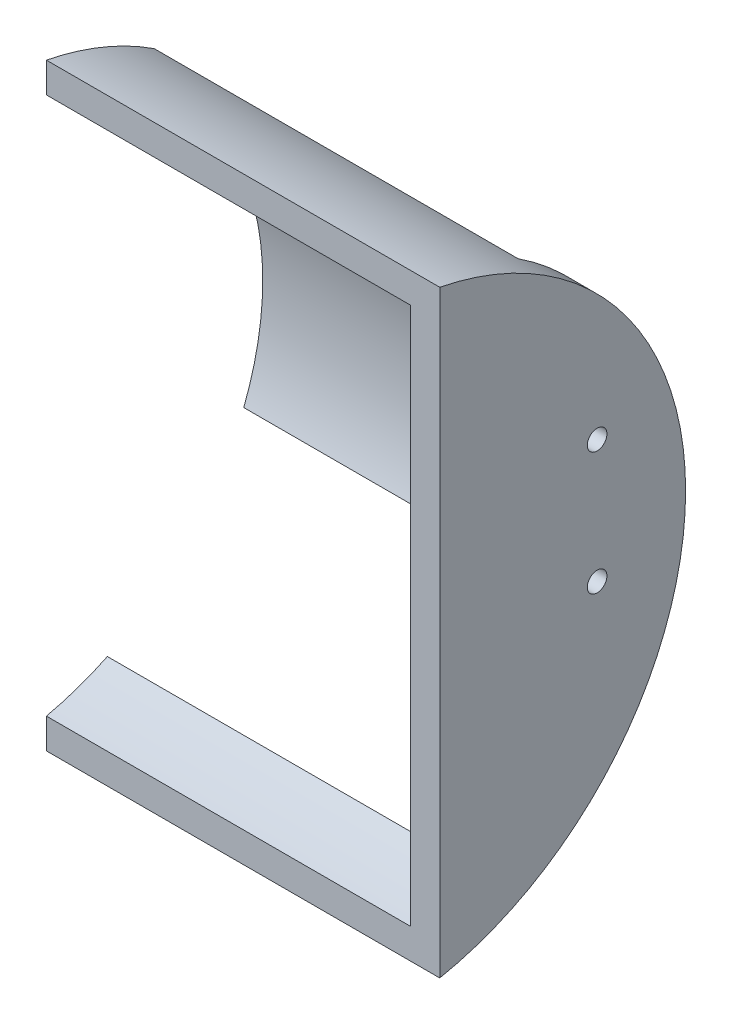
ISO-10303-21;
HEADER;
FILE_DESCRIPTION(('STEP AP214'),'2;1');
FILE_NAME('part.step','',(''),(''),'','','');
FILE_SCHEMA(('AUTOMOTIVE_DESIGN { 1 0 10303 214 1 1 1 1 }'));
ENDSEC;
DATA;
#1=APPLICATION_CONTEXT('core data for automotive mechanical design processes');
#2=APPLICATION_PROTOCOL_DEFINITION('international standard','automotive_design',2000,#1);
#3=PRODUCT_CONTEXT('',#1,'mechanical');
#4=PRODUCT('Part','Part','',(#3));
#5=PRODUCT_RELATED_PRODUCT_CATEGORY('part','',(#4));
#6=PRODUCT_DEFINITION_FORMATION('','',#4);
#7=PRODUCT_DEFINITION_CONTEXT('part definition',#1,'design');
#8=PRODUCT_DEFINITION('design','',#6,#7);
#9=PRODUCT_DEFINITION_SHAPE('','',#8);
#10=(LENGTH_UNIT() NAMED_UNIT(*) SI_UNIT(.MILLI.,.METRE.));
#11=(NAMED_UNIT(*) PLANE_ANGLE_UNIT() SI_UNIT($,.RADIAN.));
#12=(NAMED_UNIT(*) SI_UNIT($,.STERADIAN.) SOLID_ANGLE_UNIT());
#13=UNCERTAINTY_MEASURE_WITH_UNIT(LENGTH_MEASURE(1.E-05),#10,'distance_accuracy_value','');
#14=(GEOMETRIC_REPRESENTATION_CONTEXT(3) GLOBAL_UNCERTAINTY_ASSIGNED_CONTEXT((#13)) GLOBAL_UNIT_ASSIGNED_CONTEXT((#10,
#11,#12)) REPRESENTATION_CONTEXT('',''));
#15=CARTESIAN_POINT('',(0.,0.,0.));
#16=DIRECTION('',(0.,0.,1.));
#17=DIRECTION('',(1.,0.,0.));
#18=AXIS2_PLACEMENT_3D('',#15,#16,#17);
#19=CARTESIAN_POINT('',(-3.,0.,0.));
#20=DIRECTION('',(-1.,0.,0.));
#21=DIRECTION('',(0.,0.,1.));
#22=AXIS2_PLACEMENT_3D('',#19,#20,#21);
#23=PLANE('',#22);
#24=CARTESIAN_POINT('',(-3.,10.,-10.5));
#25=DIRECTION('',(-1.,0.,0.));
#26=DIRECTION('',(0.,0.,1.));
#27=AXIS2_PLACEMENT_3D('',#24,#25,#26);
#28=CIRCLE('',#27,1.);
#29=CARTESIAN_POINT('',(-3.,10.,-9.5));
#30=VERTEX_POINT('',#29);
#31=EDGE_CURVE('E139',#30,#30,#28,.F.);
#32=ORIENTED_EDGE('',*,*,#31,.T.);
#33=EDGE_LOOP('',(#32));
#34=FACE_BOUND('',#33,.T.);
#35=CARTESIAN_POINT('',(-3.,-2.5,-10.5));
#36=DIRECTION('',(-1.,0.,0.));
#37=DIRECTION('',(0.,0.,1.));
#38=AXIS2_PLACEMENT_3D('',#35,#36,#37);
#39=CIRCLE('',#38,1.);
#40=CARTESIAN_POINT('',(-3.,-2.5,-9.5));
#41=VERTEX_POINT('',#40);
#42=EDGE_CURVE('E226',#41,#41,#39,.F.);
#43=ORIENTED_EDGE('',*,*,#42,.T.);
#44=EDGE_LOOP('',(#43));
#45=FACE_BOUND('',#44,.T.);
#46=DIRECTION('',(0.,-0.766044443118977,0.642787609686541));
#47=VECTOR('',#46,1.);
#48=CARTESIAN_POINT('',(-3.,8.44107654315466,10.0596832956672));
#49=LINE('',#48,#47);
#50=CARTESIAN_POINT('',(-3.,26.944745071491,-5.46673814188647));
#51=VERTEX_POINT('',#50);
#52=CARTESIAN_POINT('',(-3.,24.628474028026,-3.52315596360837));
#53=VERTEX_POINT('',#52);
#54=EDGE_CURVE('E217',#51,#53,#49,.T.);
#55=ORIENTED_EDGE('',*,*,#54,.F.);
#56=CARTESIAN_POINT('',(-3.,1.,11.5));
#57=DIRECTION('',(-1.,0.,0.));
#58=DIRECTION('',(0.,0.,1.));
#59=AXIS2_PLACEMENT_3D('',#56,#57,#58);
#60=CIRCLE('',#59,31.);
#61=CARTESIAN_POINT('',(-3.,12.2428305284079,-17.3894230075559));
#62=VERTEX_POINT('',#61);
#63=EDGE_CURVE('E222',#51,#62,#60,.T.);
#64=ORIENTED_EDGE('',*,*,#63,.T.);
#65=DIRECTION('',(0.,-0.342020143325666,0.93969262078591));
#66=VECTOR('',#65,1.);
#67=CARTESIAN_POINT('',(-3.,5.22183858694362,1.90059381379014));
#68=LINE('',#67,#66);
#69=CARTESIAN_POINT('',(-3.,11.2164934279559,-14.5695849993155));
#70=VERTEX_POINT('',#69);
#71=EDGE_CURVE('E214',#62,#70,#68,.T.);
#72=ORIENTED_EDGE('',*,*,#71,.T.);
#73=CARTESIAN_POINT('',(-3.,1.,11.5));
#74=DIRECTION('',(-1.,0.,0.));
#75=DIRECTION('',(0.,0.,1.));
#76=AXIS2_PLACEMENT_3D('',#73,#74,#75);
#77=CIRCLE('',#76,28.);
#78=CARTESIAN_POINT('',(-3.,-9.21649342795605,-14.5695849993154));
#79=VERTEX_POINT('',#78);
#80=EDGE_CURVE('E63',#79,#70,#77,.F.);
#81=ORIENTED_EDGE('',*,*,#80,.F.);
#82=DIRECTION('',(0.,0.342020143325675,0.939692620785906));
#83=VECTOR('',#82,1.);
#84=CARTESIAN_POINT('',(-3.,-3.45579414382467,1.25780620410366));
#85=LINE('',#84,#83);
#86=CARTESIAN_POINT('',(-3.,-10.2428305284081,-17.3894230075558));
#87=VERTEX_POINT('',#86);
#88=EDGE_CURVE('E212',#87,#79,#85,.T.);
#89=ORIENTED_EDGE('',*,*,#88,.F.);
#90=CARTESIAN_POINT('',(-3.,-26.5654322169714,-2.68262834214992));
#91=VERTEX_POINT('',#90);
#92=EDGE_CURVE('E220',#87,#91,#60,.T.);
#93=ORIENTED_EDGE('',*,*,#92,.T.);
#94=DIRECTION('',(0.,0.766044443118982,0.642787609686535));
#95=VECTOR('',#94,1.);
#96=CARTESIAN_POINT('',(-3.,-9.65526006688007,11.5066908721359));
#97=LINE('',#96,#95);
#98=CARTESIAN_POINT('',(-3.,-24.2024521669593,-0.69985265370554));
#99=VERTEX_POINT('',#98);
#100=EDGE_CURVE('E209',#91,#99,#97,.T.);
#101=ORIENTED_EDGE('',*,*,#100,.T.);
#102=CARTESIAN_POINT('',(-3.,1.,11.5));
#103=DIRECTION('',(-1.,0.,0.));
#104=DIRECTION('',(0.,0.,1.));
#105=AXIS2_PLACEMENT_3D('',#102,#103,#104);
#106=CIRCLE('',#105,28.);
#107=CARTESIAN_POINT('',(-3.,-26.3495886623547,5.5));
#108=VERTEX_POINT('',#107);
#109=EDGE_CURVE('E167',#108,#99,#106,.F.);
#110=ORIENTED_EDGE('',*,*,#109,.F.);
#111=DIRECTION('',(0.,1.,0.));
#112=VECTOR('',#111,1.);
#113=CARTESIAN_POINT('',(-3.,0.,5.5));
#114=LINE('',#113,#112);
#115=CARTESIAN_POINT('',(-3.,28.3495886623547,5.49999999999999));
#116=VERTEX_POINT('',#115);
#117=EDGE_CURVE('E224',#108,#116,#114,.T.);
#118=ORIENTED_EDGE('',*,*,#117,.T.);
#119=CARTESIAN_POINT('',(-3.,1.,11.5));
#120=DIRECTION('',(-1.,0.,0.));
#121=DIRECTION('',(0.,0.,1.));
#122=AXIS2_PLACEMENT_3D('',#119,#120,#121);
#123=CIRCLE('',#122,28.);
#124=EDGE_CURVE('E56',#53,#116,#123,.F.);
#125=ORIENTED_EDGE('',*,*,#124,.F.);
#126=EDGE_LOOP('',(#55,#64,#72,#81,#89,#93,#101,#110,#118,#125));
#127=FACE_BOUND('',#126,.T.);
#128=ADVANCED_FACE('F41',(#34,#45,#127),#23,.T.);
#129=CARTESIAN_POINT('',(-3.,1.,11.5));
#130=DIRECTION('',(1.,0.,0.));
#131=DIRECTION('',(0.,0.,-1.));
#132=AXIS2_PLACEMENT_3D('',#129,#130,#131);
#133=CYLINDRICAL_SURFACE('',#132,31.);
#134=DIRECTION('',(1.,0.,0.));
#135=VECTOR('',#134,1.);
#136=CARTESIAN_POINT('',(-3.,-29.4138126514911,5.5));
#137=LINE('',#136,#135);
#138=CARTESIAN_POINT('',(-40.,-29.4138126514911,5.5));
#139=VERTEX_POINT('',#138);
#140=CARTESIAN_POINT('',(0.,-29.4138126514911,5.5));
#141=VERTEX_POINT('',#140);
#142=EDGE_CURVE('E11',#139,#141,#137,.T.);
#143=ORIENTED_EDGE('',*,*,#142,.F.);
#144=CARTESIAN_POINT('',(-40.,1.,11.5));
#145=DIRECTION('',(-1.,0.,0.));
#146=DIRECTION('',(0.,0.,1.));
#147=AXIS2_PLACEMENT_3D('',#144,#145,#146);
#148=CIRCLE('',#147,31.);
#149=CARTESIAN_POINT('',(-40.,-26.5654322169714,-2.68262834214992));
#150=VERTEX_POINT('',#149);
#151=EDGE_CURVE('E191',#150,#139,#148,.T.);
#152=ORIENTED_EDGE('',*,*,#151,.F.);
#153=DIRECTION('',(1.,0.,0.));
#154=VECTOR('',#153,1.);
#155=CARTESIAN_POINT('',(-40.,-26.5654322169714,-2.68262834214992));
#156=LINE('',#155,#154);
#157=EDGE_CURVE('E172',#150,#91,#156,.T.);
#158=ORIENTED_EDGE('',*,*,#157,.T.);
#159=ORIENTED_EDGE('',*,*,#92,.F.);
#160=DIRECTION('',(1.,0.,0.));
#161=VECTOR('',#160,1.);
#162=CARTESIAN_POINT('',(-40.,-10.2428305284081,-17.3894230075558));
#163=LINE('',#162,#161);
#164=CARTESIAN_POINT('',(-40.,-10.2428305284081,-17.3894230075558));
#165=VERTEX_POINT('',#164);
#166=EDGE_CURVE('E156',#165,#87,#163,.T.);
#167=ORIENTED_EDGE('',*,*,#166,.F.);
#168=CARTESIAN_POINT('',(-40.,1.,11.5));
#169=DIRECTION('',(-1.,0.,0.));
#170=DIRECTION('',(0.,0.,1.));
#171=AXIS2_PLACEMENT_3D('',#168,#169,#170);
#172=CIRCLE('',#171,31.);
#173=CARTESIAN_POINT('',(-40.,12.2428305284079,-17.3894230075559));
#174=VERTEX_POINT('',#173);
#175=EDGE_CURVE('E171',#174,#165,#172,.T.);
#176=ORIENTED_EDGE('',*,*,#175,.F.);
#177=DIRECTION('',(1.,0.,0.));
#178=VECTOR('',#177,1.);
#179=CARTESIAN_POINT('',(-40.,12.2428305284079,-17.3894230075559));
#180=LINE('',#179,#178);
#181=EDGE_CURVE('E153',#174,#62,#180,.T.);
#182=ORIENTED_EDGE('',*,*,#181,.T.);
#183=ORIENTED_EDGE('',*,*,#63,.F.);
#184=DIRECTION('',(1.,0.,0.));
#185=VECTOR('',#184,1.);
#186=CARTESIAN_POINT('',(-40.,26.944745071491,-5.46673814188647));
#187=LINE('',#186,#185);
#188=CARTESIAN_POINT('',(-40.,26.944745071491,-5.46673814188647));
#189=VERTEX_POINT('',#188);
#190=EDGE_CURVE('E144',#189,#51,#187,.T.);
#191=ORIENTED_EDGE('',*,*,#190,.F.);
#192=CARTESIAN_POINT('',(-40.,1.,11.5));
#193=DIRECTION('',(-1.,0.,0.));
#194=DIRECTION('',(0.,0.,1.));
#195=AXIS2_PLACEMENT_3D('',#192,#193,#194);
#196=CIRCLE('',#195,31.);
#197=CARTESIAN_POINT('',(-40.,31.4138126514911,5.49999999999999));
#198=VERTEX_POINT('',#197);
#199=EDGE_CURVE('E141',#198,#189,#196,.T.);
#200=ORIENTED_EDGE('',*,*,#199,.F.);
#201=DIRECTION('',(1.,0.,0.));
#202=VECTOR('',#201,1.);
#203=CARTESIAN_POINT('',(-3.,31.4138126514911,5.49999999999999));
#204=LINE('',#203,#202);
#205=CARTESIAN_POINT('',(0.,31.4138126514911,5.49999999999999));
#206=VERTEX_POINT('',#205);
#207=EDGE_CURVE('E49',#198,#206,#204,.T.);
#208=ORIENTED_EDGE('',*,*,#207,.T.);
#209=CARTESIAN_POINT('',(0.,1.,11.5));
#210=DIRECTION('',(-1.,0.,0.));
#211=DIRECTION('',(0.,0.,1.));
#212=AXIS2_PLACEMENT_3D('',#209,#210,#211);
#213=CIRCLE('',#212,31.);
#214=EDGE_CURVE('E219',#206,#141,#213,.T.);
#215=ORIENTED_EDGE('',*,*,#214,.T.);
#216=EDGE_LOOP('',(#143,#152,#158,#159,#167,#176,#182,#183,#191,#200,#208,#215));
#217=FACE_BOUND('',#216,.T.);
#218=ADVANCED_FACE('F43',(#217),#133,.T.);
#219=CARTESIAN_POINT('',(-3.,-2.5,-10.5));
#220=DIRECTION('',(1.,0.,0.));
#221=DIRECTION('',(0.,0.,-1.));
#222=AXIS2_PLACEMENT_3D('',#219,#220,#221);
#223=CYLINDRICAL_SURFACE('',#222,1.);
#224=ORIENTED_EDGE('',*,*,#42,.F.);
#225=EDGE_LOOP('',(#224));
#226=FACE_BOUND('',#225,.T.);
#227=CARTESIAN_POINT('',(0.,-2.5,-10.5));
#228=DIRECTION('',(-1.,0.,0.));
#229=DIRECTION('',(0.,0.,1.));
#230=AXIS2_PLACEMENT_3D('',#227,#228,#229);
#231=CIRCLE('',#230,1.);
#232=CARTESIAN_POINT('',(0.,-2.5,-9.5));
#233=VERTEX_POINT('',#232);
#234=EDGE_CURVE('E233',#233,#233,#231,.F.);
#235=ORIENTED_EDGE('',*,*,#234,.T.);
#236=EDGE_LOOP('',(#235));
#237=FACE_BOUND('',#236,.T.);
#238=ADVANCED_FACE('F265',(#226,#237),#223,.F.);
#239=CARTESIAN_POINT('',(-3.,0.,5.5));
#240=DIRECTION('',(0.,0.,-1.));
#241=DIRECTION('',(0.,1.,0.));
#242=AXIS2_PLACEMENT_3D('',#239,#240,#241);
#243=PLANE('',#242);
#244=DIRECTION('',(0.,1.,0.));
#245=VECTOR('',#244,1.);
#246=CARTESIAN_POINT('',(0.,0.,5.5));
#247=LINE('',#246,#245);
#248=EDGE_CURVE('E136',#141,#206,#247,.T.);
#249=ORIENTED_EDGE('',*,*,#248,.T.);
#250=ORIENTED_EDGE('',*,*,#207,.F.);
#251=DIRECTION('',(0.,1.,0.));
#252=VECTOR('',#251,1.);
#253=CARTESIAN_POINT('',(-40.,0.,5.5));
#254=LINE('',#253,#252);
#255=CARTESIAN_POINT('',(-40.,28.3495886623547,5.49999999999999));
#256=VERTEX_POINT('',#255);
#257=EDGE_CURVE('E133',#256,#198,#254,.T.);
#258=ORIENTED_EDGE('',*,*,#257,.F.);
#259=DIRECTION('',(1.,0.,0.));
#260=VECTOR('',#259,1.);
#261=CARTESIAN_POINT('',(-40.,28.3495886623547,5.49999999999999));
#262=LINE('',#261,#260);
#263=EDGE_CURVE('E161',#256,#116,#262,.T.);
#264=ORIENTED_EDGE('',*,*,#263,.T.);
#265=ORIENTED_EDGE('',*,*,#117,.F.);
#266=DIRECTION('',(1.,0.,0.));
#267=VECTOR('',#266,1.);
#268=CARTESIAN_POINT('',(-40.,-26.3495886623547,5.5));
#269=LINE('',#268,#267);
#270=CARTESIAN_POINT('',(-40.,-26.3495886623547,5.5));
#271=VERTEX_POINT('',#270);
#272=EDGE_CURVE('E202',#271,#108,#269,.T.);
#273=ORIENTED_EDGE('',*,*,#272,.F.);
#274=DIRECTION('',(0.,1.,0.));
#275=VECTOR('',#274,1.);
#276=CARTESIAN_POINT('',(-40.,0.,5.5));
#277=LINE('',#276,#275);
#278=EDGE_CURVE('E194',#139,#271,#277,.T.);
#279=ORIENTED_EDGE('',*,*,#278,.F.);
#280=ORIENTED_EDGE('',*,*,#142,.T.);
#281=EDGE_LOOP('',(#249,#250,#258,#264,#265,#273,#279,#280));
#282=FACE_BOUND('',#281,.T.);
#283=ADVANCED_FACE('F130',(#282),#243,.F.);
#284=CARTESIAN_POINT('',(-3.,10.,-10.5));
#285=DIRECTION('',(1.,0.,0.));
#286=DIRECTION('',(0.,0.,-1.));
#287=AXIS2_PLACEMENT_3D('',#284,#285,#286);
#288=CYLINDRICAL_SURFACE('',#287,1.);
#289=ORIENTED_EDGE('',*,*,#31,.F.);
#290=EDGE_LOOP('',(#289));
#291=FACE_BOUND('',#290,.T.);
#292=CARTESIAN_POINT('',(0.,10.,-10.5));
#293=DIRECTION('',(-1.,0.,0.));
#294=DIRECTION('',(0.,0.,1.));
#295=AXIS2_PLACEMENT_3D('',#292,#293,#294);
#296=CIRCLE('',#295,1.);
#297=CARTESIAN_POINT('',(0.,10.,-9.5));
#298=VERTEX_POINT('',#297);
#299=EDGE_CURVE('E223',#298,#298,#296,.F.);
#300=ORIENTED_EDGE('',*,*,#299,.T.);
#301=EDGE_LOOP('',(#300));
#302=FACE_BOUND('',#301,.T.);
#303=ADVANCED_FACE('F239',(#291,#302),#288,.F.);
#304=CARTESIAN_POINT('',(0.,0.,0.));
#305=DIRECTION('',(-1.,0.,0.));
#306=DIRECTION('',(0.,0.,1.));
#307=AXIS2_PLACEMENT_3D('',#304,#305,#306);
#308=PLANE('',#307);
#309=ORIENTED_EDGE('',*,*,#248,.F.);
#310=ORIENTED_EDGE('',*,*,#214,.F.);
#311=EDGE_LOOP('',(#309,#310));
#312=FACE_BOUND('',#311,.T.);
#313=ORIENTED_EDGE('',*,*,#234,.F.);
#314=EDGE_LOOP('',(#313));
#315=FACE_BOUND('',#314,.T.);
#316=ORIENTED_EDGE('',*,*,#299,.F.);
#317=EDGE_LOOP('',(#316));
#318=FACE_BOUND('',#317,.T.);
#319=ADVANCED_FACE('F241',(#312,#315,#318),#308,.F.);
#320=CARTESIAN_POINT('',(-40.,-9.65526006688007,11.5066908721359));
#321=DIRECTION('',(0.,-0.642787609686535,0.766044443118982));
#322=DIRECTION('',(0.,-0.766044443118982,-0.642787609686535));
#323=AXIS2_PLACEMENT_3D('',#320,#321,#322);
#324=PLANE('',#323);
#325=ORIENTED_EDGE('',*,*,#100,.F.);
#326=ORIENTED_EDGE('',*,*,#157,.F.);
#327=DIRECTION('',(0.,-0.766044443118982,-0.642787609686535));
#328=VECTOR('',#327,1.);
#329=CARTESIAN_POINT('',(-40.,-9.65526006688007,11.5066908721359));
#330=LINE('',#329,#328);
#331=CARTESIAN_POINT('',(-40.,-24.2024521669593,-0.69985265370554));
#332=VERTEX_POINT('',#331);
#333=EDGE_CURVE('E188',#332,#150,#330,.T.);
#334=ORIENTED_EDGE('',*,*,#333,.F.);
#335=DIRECTION('',(1.,0.,0.));
#336=VECTOR('',#335,1.);
#337=CARTESIAN_POINT('',(-40.,-24.2024521669593,-0.69985265370554));
#338=LINE('',#337,#336);
#339=EDGE_CURVE('E199',#332,#99,#338,.T.);
#340=ORIENTED_EDGE('',*,*,#339,.T.);
#341=EDGE_LOOP('',(#325,#326,#334,#340));
#342=FACE_BOUND('',#341,.T.);
#343=ADVANCED_FACE('F243',(#342),#324,.F.);
#344=CARTESIAN_POINT('',(-40.,1.,11.5));
#345=DIRECTION('',(1.,0.,0.));
#346=DIRECTION('',(0.,0.,-1.));
#347=AXIS2_PLACEMENT_3D('',#344,#345,#346);
#348=CYLINDRICAL_SURFACE('',#347,28.);
#349=ORIENTED_EDGE('',*,*,#272,.T.);
#350=ORIENTED_EDGE('',*,*,#109,.T.);
#351=ORIENTED_EDGE('',*,*,#339,.F.);
#352=CARTESIAN_POINT('',(-40.,1.,11.5));
#353=DIRECTION('',(-1.,0.,0.));
#354=DIRECTION('',(0.,0.,1.));
#355=AXIS2_PLACEMENT_3D('',#352,#353,#354);
#356=CIRCLE('',#355,28.);
#357=EDGE_CURVE('E196',#332,#271,#356,.T.);
#358=ORIENTED_EDGE('',*,*,#357,.T.);
#359=EDGE_LOOP('',(#349,#350,#351,#358));
#360=FACE_BOUND('',#359,.T.);
#361=ADVANCED_FACE('F250',(#360),#348,.F.);
#362=CARTESIAN_POINT('',(-40.,0.,0.));
#363=DIRECTION('',(-1.,0.,0.));
#364=DIRECTION('',(0.,0.,1.));
#365=AXIS2_PLACEMENT_3D('',#362,#363,#364);
#366=PLANE('',#365);
#367=ORIENTED_EDGE('',*,*,#333,.T.);
#368=ORIENTED_EDGE('',*,*,#151,.T.);
#369=ORIENTED_EDGE('',*,*,#278,.T.);
#370=ORIENTED_EDGE('',*,*,#357,.F.);
#371=EDGE_LOOP('',(#367,#368,#369,#370));
#372=FACE_BOUND('',#371,.T.);
#373=ADVANCED_FACE('F270',(#372),#366,.T.);
#374=CARTESIAN_POINT('',(-40.,5.22183858694362,1.90059381379014));
#375=DIRECTION('',(0.,-0.939692620785909,-0.342020143325666));
#376=DIRECTION('',(0.,0.342020143325666,-0.93969262078591));
#377=AXIS2_PLACEMENT_3D('',#374,#375,#376);
#378=PLANE('',#377);
#379=ORIENTED_EDGE('',*,*,#71,.F.);
#380=ORIENTED_EDGE('',*,*,#181,.F.);
#381=DIRECTION('',(0.,0.342020143325666,-0.93969262078591));
#382=VECTOR('',#381,1.);
#383=CARTESIAN_POINT('',(-40.,5.22183858694362,1.90059381379014));
#384=LINE('',#383,#382);
#385=CARTESIAN_POINT('',(-40.,11.2164934279559,-14.5695849993155));
#386=VERTEX_POINT('',#385);
#387=EDGE_CURVE('E168',#386,#174,#384,.T.);
#388=ORIENTED_EDGE('',*,*,#387,.F.);
#389=DIRECTION('',(1.,0.,0.));
#390=VECTOR('',#389,1.);
#391=CARTESIAN_POINT('',(-40.,11.2164934279559,-14.5695849993155));
#392=LINE('',#391,#390);
#393=EDGE_CURVE('E180',#386,#70,#392,.T.);
#394=ORIENTED_EDGE('',*,*,#393,.T.);
#395=EDGE_LOOP('',(#379,#380,#388,#394));
#396=FACE_BOUND('',#395,.T.);
#397=ADVANCED_FACE('F274',(#396),#378,.F.);
#398=CARTESIAN_POINT('',(-40.,-3.45579414382467,1.25780620410366));
#399=DIRECTION('',(0.,-0.939692620785906,0.342020143325675));
#400=DIRECTION('',(0.,-0.342020143325675,-0.939692620785906));
#401=AXIS2_PLACEMENT_3D('',#398,#399,#400);
#402=PLANE('',#401);
#403=ORIENTED_EDGE('',*,*,#166,.T.);
#404=ORIENTED_EDGE('',*,*,#88,.T.);
#405=DIRECTION('',(1.,0.,0.));
#406=VECTOR('',#405,1.);
#407=CARTESIAN_POINT('',(-40.,-9.21649342795605,-14.5695849993154));
#408=LINE('',#407,#406);
#409=CARTESIAN_POINT('',(-40.,-9.21649342795605,-14.5695849993154));
#410=VERTEX_POINT('',#409);
#411=EDGE_CURVE('E183',#410,#79,#408,.T.);
#412=ORIENTED_EDGE('',*,*,#411,.F.);
#413=DIRECTION('',(0.,-0.342020143325675,-0.939692620785906));
#414=VECTOR('',#413,1.);
#415=CARTESIAN_POINT('',(-40.,-3.45579414382467,1.25780620410366));
#416=LINE('',#415,#414);
#417=EDGE_CURVE('E174',#410,#165,#416,.T.);
#418=ORIENTED_EDGE('',*,*,#417,.T.);
#419=EDGE_LOOP('',(#403,#404,#412,#418));
#420=FACE_BOUND('',#419,.T.);
#421=ADVANCED_FACE('F278',(#420),#402,.T.);
#422=CARTESIAN_POINT('',(-40.,1.,11.5));
#423=DIRECTION('',(1.,0.,0.));
#424=DIRECTION('',(0.,0.,-1.));
#425=AXIS2_PLACEMENT_3D('',#422,#423,#424);
#426=CYLINDRICAL_SURFACE('',#425,28.);
#427=ORIENTED_EDGE('',*,*,#411,.T.);
#428=ORIENTED_EDGE('',*,*,#80,.T.);
#429=ORIENTED_EDGE('',*,*,#393,.F.);
#430=CARTESIAN_POINT('',(-40.,1.,11.5));
#431=DIRECTION('',(-1.,0.,0.));
#432=DIRECTION('',(0.,0.,1.));
#433=AXIS2_PLACEMENT_3D('',#430,#431,#432);
#434=CIRCLE('',#433,28.);
#435=EDGE_CURVE('E177',#386,#410,#434,.T.);
#436=ORIENTED_EDGE('',*,*,#435,.T.);
#437=EDGE_LOOP('',(#427,#428,#429,#436));
#438=FACE_BOUND('',#437,.T.);
#439=ADVANCED_FACE('F282',(#438),#426,.F.);
#440=CARTESIAN_POINT('',(-40.,0.,0.));
#441=DIRECTION('',(-1.,0.,0.));
#442=DIRECTION('',(0.,0.,1.));
#443=AXIS2_PLACEMENT_3D('',#440,#441,#442);
#444=PLANE('',#443);
#445=ORIENTED_EDGE('',*,*,#387,.T.);
#446=ORIENTED_EDGE('',*,*,#175,.T.);
#447=ORIENTED_EDGE('',*,*,#417,.F.);
#448=ORIENTED_EDGE('',*,*,#435,.F.);
#449=EDGE_LOOP('',(#445,#446,#447,#448));
#450=FACE_BOUND('',#449,.T.);
#451=ADVANCED_FACE('F286',(#450),#444,.T.);
#452=CARTESIAN_POINT('',(-40.,8.44107654315467,10.0596832956672));
#453=DIRECTION('',(0.,-0.642787609686541,-0.766044443118977));
#454=DIRECTION('',(0.,0.766044443118977,-0.642787609686541));
#455=AXIS2_PLACEMENT_3D('',#452,#453,#454);
#456=PLANE('',#455);
#457=ORIENTED_EDGE('',*,*,#190,.T.);
#458=ORIENTED_EDGE('',*,*,#54,.T.);
#459=DIRECTION('',(1.,0.,0.));
#460=VECTOR('',#459,1.);
#461=CARTESIAN_POINT('',(-40.,24.628474028026,-3.52315596360837));
#462=LINE('',#461,#460);
#463=CARTESIAN_POINT('',(-40.,24.628474028026,-3.52315596360837));
#464=VERTEX_POINT('',#463);
#465=EDGE_CURVE('E163',#464,#53,#462,.T.);
#466=ORIENTED_EDGE('',*,*,#465,.F.);
#467=DIRECTION('',(0.,0.766044443118977,-0.642787609686541));
#468=VECTOR('',#467,1.);
#469=CARTESIAN_POINT('',(-40.,8.44107654315467,10.0596832956672));
#470=LINE('',#469,#468);
#471=EDGE_CURVE('E148',#464,#189,#470,.T.);
#472=ORIENTED_EDGE('',*,*,#471,.T.);
#473=EDGE_LOOP('',(#457,#458,#466,#472));
#474=FACE_BOUND('',#473,.T.);
#475=ADVANCED_FACE('F290',(#474),#456,.T.);
#476=CARTESIAN_POINT('',(-40.,1.,11.5));
#477=DIRECTION('',(1.,0.,0.));
#478=DIRECTION('',(0.,0.,-1.));
#479=AXIS2_PLACEMENT_3D('',#476,#477,#478);
#480=CYLINDRICAL_SURFACE('',#479,28.);
#481=ORIENTED_EDGE('',*,*,#465,.T.);
#482=ORIENTED_EDGE('',*,*,#124,.T.);
#483=ORIENTED_EDGE('',*,*,#263,.F.);
#484=CARTESIAN_POINT('',(-40.,1.,11.5));
#485=DIRECTION('',(-1.,0.,0.));
#486=DIRECTION('',(0.,0.,1.));
#487=AXIS2_PLACEMENT_3D('',#484,#485,#486);
#488=CIRCLE('',#487,28.);
#489=EDGE_CURVE('E152',#256,#464,#488,.T.);
#490=ORIENTED_EDGE('',*,*,#489,.T.);
#491=EDGE_LOOP('',(#481,#482,#483,#490));
#492=FACE_BOUND('',#491,.T.);
#493=ADVANCED_FACE('F294',(#492),#480,.F.);
#494=CARTESIAN_POINT('',(-40.,0.,0.));
#495=DIRECTION('',(-1.,0.,0.));
#496=DIRECTION('',(0.,0.,1.));
#497=AXIS2_PLACEMENT_3D('',#494,#495,#496);
#498=PLANE('',#497);
#499=ORIENTED_EDGE('',*,*,#257,.T.);
#500=ORIENTED_EDGE('',*,*,#199,.T.);
#501=ORIENTED_EDGE('',*,*,#471,.F.);
#502=ORIENTED_EDGE('',*,*,#489,.F.);
#503=EDGE_LOOP('',(#499,#500,#501,#502));
#504=FACE_BOUND('',#503,.T.);
#505=ADVANCED_FACE('F150',(#504),#498,.T.);
#506=CLOSED_SHELL('',(#128,#218,#238,#283,#303,#319,#343,#361,#373,#397,#421,#439,#451,#475,
#493,#505));
#507=MANIFOLD_SOLID_BREP('B2',#506);
#508=ADVANCED_BREP_SHAPE_REPRESENTATION('',(#18,#507),#14);
#509=SHAPE_DEFINITION_REPRESENTATION(#9,#508);
ENDSEC;
END-ISO-10303-21;
